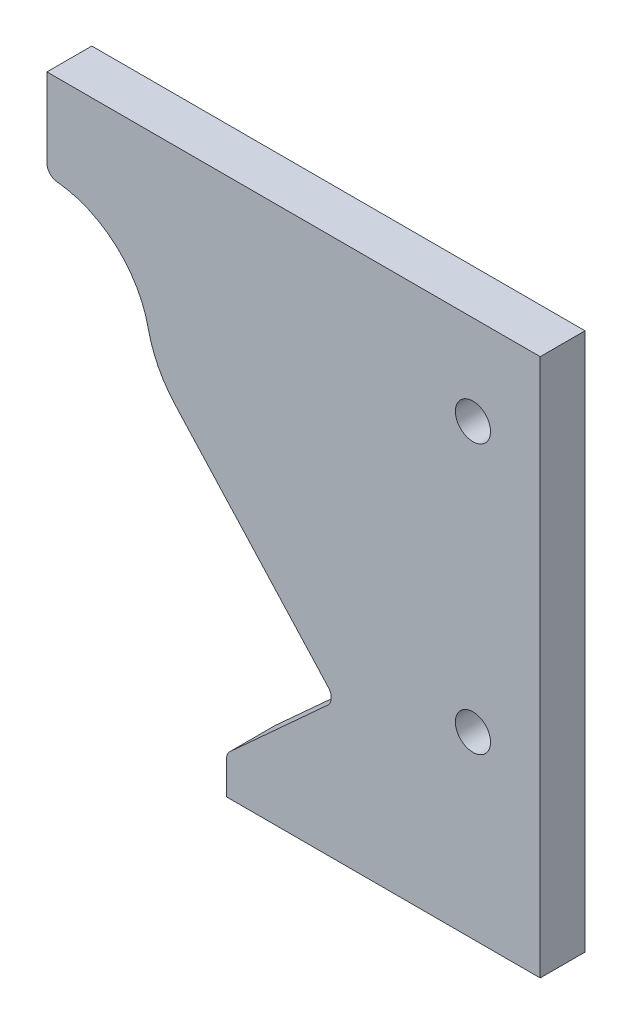
ISO-10303-21;
HEADER;
FILE_DESCRIPTION(('STEP AP214'),'2;1');
FILE_NAME('part.step','',(''),(''),'','','');
FILE_SCHEMA(('AUTOMOTIVE_DESIGN { 1 0 10303 214 1 1 1 1 }'));
ENDSEC;
DATA;
#1=APPLICATION_CONTEXT('core data for automotive mechanical design processes');
#2=APPLICATION_PROTOCOL_DEFINITION('international standard','automotive_design',2000,#1);
#3=PRODUCT_CONTEXT('',#1,'mechanical');
#4=PRODUCT('Part','Part','',(#3));
#5=PRODUCT_RELATED_PRODUCT_CATEGORY('part','',(#4));
#6=PRODUCT_DEFINITION_FORMATION('','',#4);
#7=PRODUCT_DEFINITION_CONTEXT('part definition',#1,'design');
#8=PRODUCT_DEFINITION('design','',#6,#7);
#9=PRODUCT_DEFINITION_SHAPE('','',#8);
#10=(LENGTH_UNIT() NAMED_UNIT(*) SI_UNIT(.MILLI.,.METRE.));
#11=(NAMED_UNIT(*) PLANE_ANGLE_UNIT() SI_UNIT($,.RADIAN.));
#12=(NAMED_UNIT(*) SI_UNIT($,.STERADIAN.) SOLID_ANGLE_UNIT());
#13=UNCERTAINTY_MEASURE_WITH_UNIT(LENGTH_MEASURE(1.E-05),#10,'distance_accuracy_value','');
#14=(GEOMETRIC_REPRESENTATION_CONTEXT(3) GLOBAL_UNCERTAINTY_ASSIGNED_CONTEXT((#13)) GLOBAL_UNIT_ASSIGNED_CONTEXT((#10,
#11,#12)) REPRESENTATION_CONTEXT('',''));
#15=CARTESIAN_POINT('',(0.,0.,0.));
#16=DIRECTION('',(0.,0.,1.));
#17=DIRECTION('',(1.,0.,0.));
#18=AXIS2_PLACEMENT_3D('',#15,#16,#17);
#19=CARTESIAN_POINT('',(0.,0.,3.175));
#20=DIRECTION('',(0.,0.,1.));
#21=DIRECTION('',(1.,0.,0.));
#22=AXIS2_PLACEMENT_3D('',#19,#20,#21);
#23=PLANE('',#22);
#24=CARTESIAN_POINT('',(60.325,-23.4188,3.175));
#25=DIRECTION('',(0.,0.,1.));
#26=DIRECTION('',(1.,0.,0.));
#27=AXIS2_PLACEMENT_3D('',#24,#25,#26);
#28=CIRCLE('',#27,2.4892);
#29=CARTESIAN_POINT('',(62.8142,-23.4188,3.175));
#30=VERTEX_POINT('',#29);
#31=EDGE_CURVE('E187',#30,#30,#28,.T.);
#32=ORIENTED_EDGE('',*,*,#31,.F.);
#33=EDGE_LOOP('',(#32));
#34=FACE_BOUND('',#33,.T.);
#35=DIRECTION('',(0.,-1.,0.));
#36=VECTOR('',#35,1.);
#37=CARTESIAN_POINT('',(0.,27.3812,3.175));
#38=LINE('',#37,#36);
#39=CARTESIAN_POINT('',(0.,27.3812,3.175));
#40=VERTEX_POINT('',#39);
#41=CARTESIAN_POINT('',(0.,16.1910606026906,3.175));
#42=VERTEX_POINT('',#41);
#43=EDGE_CURVE('E144',#40,#42,#38,.T.);
#44=ORIENTED_EDGE('',*,*,#43,.T.);
#45=CARTESIAN_POINT('',(1.5875,16.1910606026906,3.175));
#46=DIRECTION('',(0.,0.,1.));
#47=DIRECTION('',(1.,0.,0.));
#48=AXIS2_PLACEMENT_3D('',#45,#46,#47);
#49=CIRCLE('',#48,1.5875);
#50=CARTESIAN_POINT('',(1.43259172521468,14.6111366562922,3.175));
#51=VERTEX_POINT('',#50);
#52=EDGE_CURVE('E139',#42,#51,#49,.T.);
#53=ORIENTED_EDGE('',*,*,#52,.T.);
#54=CARTESIAN_POINT('',(0.,0.,3.175));
#55=DIRECTION('',(0.,0.,-1.));
#56=DIRECTION('',(1.,0.,0.));
#57=AXIS2_PLACEMENT_3D('',#54,#55,#56);
#58=CIRCLE('',#57,14.6812);
#59=CARTESIAN_POINT('',(14.3640874758787,3.03490105692157,3.175));
#60=VERTEX_POINT('',#59);
#61=EDGE_CURVE('E130',#51,#60,#58,.T.);
#62=ORIENTED_EDGE('',*,*,#61,.T.);
#63=CARTESIAN_POINT('',(29.8961889852617,6.31658472573749,3.175));
#64=DIRECTION('',(0.,0.,1.));
#65=DIRECTION('',(-1.,0.,0.));
#66=AXIS2_PLACEMENT_3D('',#63,#64,#65);
#67=CIRCLE('',#66,15.8749999999984);
#68=CARTESIAN_POINT('',(18.1620071037488,-4.37568353555873,3.175));
#69=VERTEX_POINT('',#68);
#70=EDGE_CURVE('E136',#60,#69,#67,.T.);
#71=ORIENTED_EDGE('',*,*,#70,.T.);
#72=DIRECTION('',(0.673528709373064,-0.73916106340246,0.));
#73=VECTOR('',#72,1.);
#74=CARTESIAN_POINT('',(40.9151539637892,-29.3460225794202,3.175));
#75=LINE('',#74,#73);
#76=CARTESIAN_POINT('',(39.8459271376594,-28.1726043912687,3.175));
#77=VERTEX_POINT('',#76);
#78=EDGE_CURVE('E161',#69,#77,#75,.T.);
#79=ORIENTED_EDGE('',*,*,#78,.T.);
#80=CARTESIAN_POINT('',(38.672508949508,-29.2418312173985,3.175));
#81=DIRECTION('',(0.,0.,1.));
#82=DIRECTION('',(1.,0.,0.));
#83=AXIS2_PLACEMENT_3D('',#80,#81,#82);
#84=CIRCLE('',#83,1.5875);
#85=CARTESIAN_POINT('',(39.7417357756377,-30.4152494055499,3.175));
#86=VERTEX_POINT('',#85);
#87=EDGE_CURVE('E11',#77,#86,#84,.F.);
#88=ORIENTED_EDGE('',*,*,#87,.T.);
#89=DIRECTION('',(-0.739161063402485,-0.673528709373036,0.));
#90=VECTOR('',#89,1.);
#91=CARTESIAN_POINT('',(25.4260338801902,-43.4598166843321,3.175));
#92=LINE('',#91,#90);
#93=CARTESIAN_POINT('',(25.9443070540605,-42.987562558428,3.175));
#94=VERTEX_POINT('',#93);
#95=EDGE_CURVE('E164',#86,#94,#92,.T.);
#96=ORIENTED_EDGE('',*,*,#95,.T.);
#97=CARTESIAN_POINT('',(27.0135338801902,-44.1609807465794,3.175));
#98=DIRECTION('',(0.,0.,1.));
#99=DIRECTION('',(1.,0.,0.));
#100=AXIS2_PLACEMENT_3D('',#97,#98,#99);
#101=CIRCLE('',#100,1.5875);
#102=CARTESIAN_POINT('',(25.4260338801902,-44.1609807465794,3.175));
#103=VERTEX_POINT('',#102);
#104=EDGE_CURVE('E57',#94,#103,#101,.T.);
#105=ORIENTED_EDGE('',*,*,#104,.T.);
#106=DIRECTION('',(0.,-1.,0.));
#107=VECTOR('',#106,1.);
#108=CARTESIAN_POINT('',(25.4260338801902,-48.8188,3.175));
#109=LINE('',#108,#107);
#110=CARTESIAN_POINT('',(25.4260338801902,-48.8188,3.175));
#111=VERTEX_POINT('',#110);
#112=EDGE_CURVE('E170',#103,#111,#109,.T.);
#113=ORIENTED_EDGE('',*,*,#112,.T.);
#114=DIRECTION('',(1.,0.,0.));
#115=VECTOR('',#114,1.);
#116=CARTESIAN_POINT('',(69.85,-48.8188,3.175));
#117=LINE('',#116,#115);
#118=CARTESIAN_POINT('',(69.85,-48.8188,3.175));
#119=VERTEX_POINT('',#118);
#120=EDGE_CURVE('E173',#111,#119,#117,.T.);
#121=ORIENTED_EDGE('',*,*,#120,.T.);
#122=DIRECTION('',(0.,1.,0.));
#123=VECTOR('',#122,1.);
#124=CARTESIAN_POINT('',(69.85,27.3812,3.175));
#125=LINE('',#124,#123);
#126=CARTESIAN_POINT('',(69.85,27.3812,3.175));
#127=VERTEX_POINT('',#126);
#128=EDGE_CURVE('E176',#119,#127,#125,.T.);
#129=ORIENTED_EDGE('',*,*,#128,.T.);
#130=DIRECTION('',(-1.,0.,0.));
#131=VECTOR('',#130,1.);
#132=CARTESIAN_POINT('',(0.,27.3812,3.175));
#133=LINE('',#132,#131);
#134=EDGE_CURVE('E179',#127,#40,#133,.T.);
#135=ORIENTED_EDGE('',*,*,#134,.T.);
#136=EDGE_LOOP('',(#44,#53,#62,#71,#79,#88,#96,#105,#113,#121,#129,#135));
#137=FACE_BOUND('',#136,.T.);
#138=CARTESIAN_POINT('',(60.325,14.6812,3.175));
#139=DIRECTION('',(0.,0.,1.));
#140=DIRECTION('',(1.,0.,0.));
#141=AXIS2_PLACEMENT_3D('',#138,#139,#140);
#142=CIRCLE('',#141,2.4892);
#143=CARTESIAN_POINT('',(62.8142,14.6812,3.175));
#144=VERTEX_POINT('',#143);
#145=EDGE_CURVE('E302',#144,#144,#142,.T.);
#146=ORIENTED_EDGE('',*,*,#145,.F.);
#147=EDGE_LOOP('',(#146));
#148=FACE_BOUND('',#147,.T.);
#149=ADVANCED_FACE('F41',(#34,#137,#148),#23,.T.);
#150=CARTESIAN_POINT('',(0.,0.,-3.175));
#151=DIRECTION('',(0.,0.,1.));
#152=DIRECTION('',(1.,0.,0.));
#153=AXIS2_PLACEMENT_3D('',#150,#151,#152);
#154=PLANE('',#153);
#155=CARTESIAN_POINT('',(0.,0.,-3.175));
#156=DIRECTION('',(0.,0.,-1.));
#157=DIRECTION('',(1.,0.,0.));
#158=AXIS2_PLACEMENT_3D('',#155,#156,#157);
#159=CIRCLE('',#158,14.6812);
#160=CARTESIAN_POINT('',(1.43259172521468,14.6111366562922,-3.175));
#161=VERTEX_POINT('',#160);
#162=CARTESIAN_POINT('',(14.3640874758787,3.03490105692157,-3.175));
#163=VERTEX_POINT('',#162);
#164=EDGE_CURVE('E150',#161,#163,#159,.T.);
#165=ORIENTED_EDGE('',*,*,#164,.F.);
#166=CARTESIAN_POINT('',(1.5875,16.1910606026906,-3.175));
#167=DIRECTION('',(0.,0.,1.));
#168=DIRECTION('',(1.,0.,0.));
#169=AXIS2_PLACEMENT_3D('',#166,#167,#168);
#170=CIRCLE('',#169,1.5875);
#171=CARTESIAN_POINT('',(0.,16.1910606026906,-3.175));
#172=VERTEX_POINT('',#171);
#173=EDGE_CURVE('E234',#161,#172,#170,.F.);
#174=ORIENTED_EDGE('',*,*,#173,.T.);
#175=DIRECTION('',(0.,-1.,0.));
#176=VECTOR('',#175,1.);
#177=CARTESIAN_POINT('',(0.,27.3812,-3.175));
#178=LINE('',#177,#176);
#179=CARTESIAN_POINT('',(0.,27.3812,-3.175));
#180=VERTEX_POINT('',#179);
#181=EDGE_CURVE('E183',#180,#172,#178,.T.);
#182=ORIENTED_EDGE('',*,*,#181,.F.);
#183=DIRECTION('',(-1.,0.,0.));
#184=VECTOR('',#183,1.);
#185=CARTESIAN_POINT('',(0.,27.3812,-3.175));
#186=LINE('',#185,#184);
#187=CARTESIAN_POINT('',(69.85,27.3812,-3.175));
#188=VERTEX_POINT('',#187);
#189=EDGE_CURVE('E209',#188,#180,#186,.T.);
#190=ORIENTED_EDGE('',*,*,#189,.F.);
#191=DIRECTION('',(0.,1.,0.));
#192=VECTOR('',#191,1.);
#193=CARTESIAN_POINT('',(69.85,27.3812,-3.175));
#194=LINE('',#193,#192);
#195=CARTESIAN_POINT('',(69.85,-48.8188,-3.175));
#196=VERTEX_POINT('',#195);
#197=EDGE_CURVE('E206',#196,#188,#194,.T.);
#198=ORIENTED_EDGE('',*,*,#197,.F.);
#199=DIRECTION('',(1.,0.,0.));
#200=VECTOR('',#199,1.);
#201=CARTESIAN_POINT('',(69.85,-48.8188,-3.175));
#202=LINE('',#201,#200);
#203=CARTESIAN_POINT('',(25.4260338801902,-48.8188,-3.175));
#204=VERTEX_POINT('',#203);
#205=EDGE_CURVE('E203',#204,#196,#202,.T.);
#206=ORIENTED_EDGE('',*,*,#205,.F.);
#207=DIRECTION('',(0.,-1.,0.));
#208=VECTOR('',#207,1.);
#209=CARTESIAN_POINT('',(25.4260338801902,-48.8188,-3.175));
#210=LINE('',#209,#208);
#211=CARTESIAN_POINT('',(25.4260338801902,-44.1609807465794,-3.175));
#212=VERTEX_POINT('',#211);
#213=EDGE_CURVE('E200',#212,#204,#210,.T.);
#214=ORIENTED_EDGE('',*,*,#213,.F.);
#215=CARTESIAN_POINT('',(27.0135338801902,-44.1609807465794,-3.175));
#216=DIRECTION('',(0.,0.,1.));
#217=DIRECTION('',(1.,0.,0.));
#218=AXIS2_PLACEMENT_3D('',#215,#216,#217);
#219=CIRCLE('',#218,1.5875);
#220=CARTESIAN_POINT('',(25.9443070540605,-42.987562558428,-3.175));
#221=VERTEX_POINT('',#220);
#222=EDGE_CURVE('E231',#212,#221,#219,.F.);
#223=ORIENTED_EDGE('',*,*,#222,.T.);
#224=DIRECTION('',(-0.739161063402485,-0.673528709373036,0.));
#225=VECTOR('',#224,1.);
#226=CARTESIAN_POINT('',(25.4260338801902,-43.4598166843321,-3.175));
#227=LINE('',#226,#225);
#228=CARTESIAN_POINT('',(39.7417357756377,-30.4152494055499,-3.175));
#229=VERTEX_POINT('',#228);
#230=EDGE_CURVE('E197',#229,#221,#227,.T.);
#231=ORIENTED_EDGE('',*,*,#230,.F.);
#232=CARTESIAN_POINT('',(38.672508949508,-29.2418312173985,-3.175));
#233=DIRECTION('',(0.,0.,1.));
#234=DIRECTION('',(1.,0.,0.));
#235=AXIS2_PLACEMENT_3D('',#232,#233,#234);
#236=CIRCLE('',#235,1.5875);
#237=CARTESIAN_POINT('',(39.8459271376594,-28.1726043912687,-3.175));
#238=VERTEX_POINT('',#237);
#239=EDGE_CURVE('E50',#229,#238,#236,.T.);
#240=ORIENTED_EDGE('',*,*,#239,.T.);
#241=DIRECTION('',(0.673528709373064,-0.73916106340246,0.));
#242=VECTOR('',#241,1.);
#243=CARTESIAN_POINT('',(40.9151539637892,-29.3460225794202,-3.175));
#244=LINE('',#243,#242);
#245=CARTESIAN_POINT('',(18.1620071037488,-4.37568353555873,-3.175));
#246=VERTEX_POINT('',#245);
#247=EDGE_CURVE('E193',#246,#238,#244,.T.);
#248=ORIENTED_EDGE('',*,*,#247,.F.);
#249=CARTESIAN_POINT('',(29.8961889852617,6.31658472573749,-3.175));
#250=DIRECTION('',(0.,0.,1.));
#251=DIRECTION('',(-1.,0.,0.));
#252=AXIS2_PLACEMENT_3D('',#249,#250,#251);
#253=CIRCLE('',#252,15.8749999999984);
#254=EDGE_CURVE('E190',#163,#246,#253,.T.);
#255=ORIENTED_EDGE('',*,*,#254,.F.);
#256=EDGE_LOOP('',(#165,#174,#182,#190,#198,#206,#214,#223,#231,#240,#248,#255));
#257=FACE_BOUND('',#256,.T.);
#258=CARTESIAN_POINT('',(60.325,-23.4188,-3.175));
#259=DIRECTION('',(0.,0.,1.));
#260=DIRECTION('',(1.,0.,0.));
#261=AXIS2_PLACEMENT_3D('',#258,#259,#260);
#262=CIRCLE('',#261,2.4892);
#263=CARTESIAN_POINT('',(62.8142,-23.4188,-3.175));
#264=VERTEX_POINT('',#263);
#265=EDGE_CURVE('E298',#264,#264,#262,.T.);
#266=ORIENTED_EDGE('',*,*,#265,.T.);
#267=EDGE_LOOP('',(#266));
#268=FACE_BOUND('',#267,.T.);
#269=CARTESIAN_POINT('',(60.325,14.6812,-3.175));
#270=DIRECTION('',(0.,0.,1.));
#271=DIRECTION('',(1.,0.,0.));
#272=AXIS2_PLACEMENT_3D('',#269,#270,#271);
#273=CIRCLE('',#272,2.4892);
#274=CARTESIAN_POINT('',(62.8142,14.6812,-3.175));
#275=VERTEX_POINT('',#274);
#276=EDGE_CURVE('E306',#275,#275,#273,.T.);
#277=ORIENTED_EDGE('',*,*,#276,.T.);
#278=EDGE_LOOP('',(#277));
#279=FACE_BOUND('',#278,.T.);
#280=ADVANCED_FACE('F260',(#257,#268,#279),#154,.F.);
#281=CARTESIAN_POINT('',(0.,27.3812,3.175));
#282=DIRECTION('',(1.,0.,0.));
#283=DIRECTION('',(0.,1.,0.));
#284=AXIS2_PLACEMENT_3D('',#281,#282,#283);
#285=PLANE('',#284);
#286=ORIENTED_EDGE('',*,*,#181,.T.);
#287=DIRECTION('',(0.,0.,-1.));
#288=VECTOR('',#287,1.);
#289=CARTESIAN_POINT('',(0.,16.1910606026906,3.175));
#290=LINE('',#289,#288);
#291=EDGE_CURVE('E237',#172,#42,#290,.F.);
#292=ORIENTED_EDGE('',*,*,#291,.T.);
#293=ORIENTED_EDGE('',*,*,#43,.F.);
#294=DIRECTION('',(0.,0.,-1.));
#295=VECTOR('',#294,1.);
#296=CARTESIAN_POINT('',(0.,27.3812,3.175));
#297=LINE('',#296,#295);
#298=EDGE_CURVE('E182',#40,#180,#297,.T.);
#299=ORIENTED_EDGE('',*,*,#298,.T.);
#300=EDGE_LOOP('',(#286,#292,#293,#299));
#301=FACE_BOUND('',#300,.T.);
#302=ADVANCED_FACE('F294',(#301),#285,.F.);
#303=CARTESIAN_POINT('',(0.,0.,3.175));
#304=DIRECTION('',(0.,0.,-1.));
#305=DIRECTION('',(-1.,0.,0.));
#306=AXIS2_PLACEMENT_3D('',#303,#304,#305);
#307=CYLINDRICAL_SURFACE('',#306,14.6812);
#308=ORIENTED_EDGE('',*,*,#61,.F.);
#309=DIRECTION('',(0.,0.,-1.));
#310=VECTOR('',#309,1.);
#311=CARTESIAN_POINT('',(1.43259172521468,14.6111366562922,3.175));
#312=LINE('',#311,#310);
#313=EDGE_CURVE('E154',#51,#161,#312,.T.);
#314=ORIENTED_EDGE('',*,*,#313,.T.);
#315=ORIENTED_EDGE('',*,*,#164,.T.);
#316=DIRECTION('',(0.,0.,-1.));
#317=VECTOR('',#316,1.);
#318=CARTESIAN_POINT('',(14.3640874758787,3.03490105692157,3.175));
#319=LINE('',#318,#317);
#320=EDGE_CURVE('E147',#60,#163,#319,.T.);
#321=ORIENTED_EDGE('',*,*,#320,.F.);
#322=EDGE_LOOP('',(#308,#314,#315,#321));
#323=FACE_BOUND('',#322,.T.);
#324=ADVANCED_FACE('F148',(#323),#307,.F.);
#325=CARTESIAN_POINT('',(29.8961889852617,6.31658472573749,3.175));
#326=DIRECTION('',(0.,0.,-1.));
#327=DIRECTION('',(-1.,0.,0.));
#328=AXIS2_PLACEMENT_3D('',#325,#326,#327);
#329=CYLINDRICAL_SURFACE('',#328,15.8749999999984);
#330=ORIENTED_EDGE('',*,*,#254,.T.);
#331=DIRECTION('',(0.,0.,-1.));
#332=VECTOR('',#331,1.);
#333=CARTESIAN_POINT('',(18.1620071037488,-4.37568353555873,3.175));
#334=LINE('',#333,#332);
#335=EDGE_CURVE('E155',#69,#246,#334,.T.);
#336=ORIENTED_EDGE('',*,*,#335,.F.);
#337=ORIENTED_EDGE('',*,*,#70,.F.);
#338=ORIENTED_EDGE('',*,*,#320,.T.);
#339=EDGE_LOOP('',(#330,#336,#337,#338));
#340=FACE_BOUND('',#339,.T.);
#341=ADVANCED_FACE('F157',(#340),#329,.T.);
#342=CARTESIAN_POINT('',(40.9151539637892,-29.3460225794202,3.175));
#343=DIRECTION('',(0.73916106340246,0.673528709373064,0.));
#344=DIRECTION('',(-0.673528709373064,0.73916106340246,0.));
#345=AXIS2_PLACEMENT_3D('',#342,#343,#344);
#346=PLANE('',#345);
#347=ORIENTED_EDGE('',*,*,#247,.T.);
#348=DIRECTION('',(0.,0.,-1.));
#349=VECTOR('',#348,1.);
#350=CARTESIAN_POINT('',(39.8459271376594,-28.1726043912687,3.175));
#351=LINE('',#350,#349);
#352=EDGE_CURVE('E250',#238,#77,#351,.F.);
#353=ORIENTED_EDGE('',*,*,#352,.T.);
#354=ORIENTED_EDGE('',*,*,#78,.F.);
#355=ORIENTED_EDGE('',*,*,#335,.T.);
#356=EDGE_LOOP('',(#347,#353,#354,#355));
#357=FACE_BOUND('',#356,.T.);
#358=ADVANCED_FACE('F266',(#357),#346,.F.);
#359=CARTESIAN_POINT('',(25.4260338801902,-43.4598166843321,3.175));
#360=DIRECTION('',(0.673528709373036,-0.739161063402485,0.));
#361=DIRECTION('',(0.739161063402485,0.673528709373036,0.));
#362=AXIS2_PLACEMENT_3D('',#359,#360,#361);
#363=PLANE('',#362);
#364=ORIENTED_EDGE('',*,*,#95,.F.);
#365=DIRECTION('',(0.,0.,-1.));
#366=VECTOR('',#365,1.);
#367=CARTESIAN_POINT('',(39.7417357756377,-30.4152494055499,-3.175));
#368=LINE('',#367,#366);
#369=EDGE_CURVE('E246',#86,#229,#368,.T.);
#370=ORIENTED_EDGE('',*,*,#369,.T.);
#371=ORIENTED_EDGE('',*,*,#230,.T.);
#372=DIRECTION('',(0.,0.,-1.));
#373=VECTOR('',#372,1.);
#374=CARTESIAN_POINT('',(25.9443070540605,-42.987562558428,3.175));
#375=LINE('',#374,#373);
#376=EDGE_CURVE('E65',#221,#94,#375,.F.);
#377=ORIENTED_EDGE('',*,*,#376,.T.);
#378=EDGE_LOOP('',(#364,#370,#371,#377));
#379=FACE_BOUND('',#378,.T.);
#380=ADVANCED_FACE('F269',(#379),#363,.F.);
#381=CARTESIAN_POINT('',(25.4260338801902,-48.8188,3.175));
#382=DIRECTION('',(1.,0.,0.));
#383=DIRECTION('',(0.,0.,-1.));
#384=AXIS2_PLACEMENT_3D('',#381,#382,#383);
#385=PLANE('',#384);
#386=ORIENTED_EDGE('',*,*,#112,.F.);
#387=DIRECTION('',(0.,0.,-1.));
#388=VECTOR('',#387,1.);
#389=CARTESIAN_POINT('',(25.4260338801902,-44.1609807465794,3.175));
#390=LINE('',#389,#388);
#391=EDGE_CURVE('E253',#103,#212,#390,.T.);
#392=ORIENTED_EDGE('',*,*,#391,.T.);
#393=ORIENTED_EDGE('',*,*,#213,.T.);
#394=DIRECTION('',(0.,0.,-1.));
#395=VECTOR('',#394,1.);
#396=CARTESIAN_POINT('',(25.4260338801902,-48.8188,3.175));
#397=LINE('',#396,#395);
#398=EDGE_CURVE('E223',#111,#204,#397,.T.);
#399=ORIENTED_EDGE('',*,*,#398,.F.);
#400=EDGE_LOOP('',(#386,#392,#393,#399));
#401=FACE_BOUND('',#400,.T.);
#402=ADVANCED_FACE('F274',(#401),#385,.F.);
#403=CARTESIAN_POINT('',(69.85,-48.8188,3.175));
#404=DIRECTION('',(0.,1.,0.));
#405=DIRECTION('',(0.,0.,1.));
#406=AXIS2_PLACEMENT_3D('',#403,#404,#405);
#407=PLANE('',#406);
#408=ORIENTED_EDGE('',*,*,#205,.T.);
#409=DIRECTION('',(0.,0.,-1.));
#410=VECTOR('',#409,1.);
#411=CARTESIAN_POINT('',(69.85,-48.8188,3.175));
#412=LINE('',#411,#410);
#413=EDGE_CURVE('E219',#119,#196,#412,.T.);
#414=ORIENTED_EDGE('',*,*,#413,.F.);
#415=ORIENTED_EDGE('',*,*,#120,.F.);
#416=ORIENTED_EDGE('',*,*,#398,.T.);
#417=EDGE_LOOP('',(#408,#414,#415,#416));
#418=FACE_BOUND('',#417,.T.);
#419=ADVANCED_FACE('F281',(#418),#407,.F.);
#420=CARTESIAN_POINT('',(69.85,27.3812,3.175));
#421=DIRECTION('',(-1.,0.,0.));
#422=DIRECTION('',(0.,-1.,0.));
#423=AXIS2_PLACEMENT_3D('',#420,#421,#422);
#424=PLANE('',#423);
#425=ORIENTED_EDGE('',*,*,#197,.T.);
#426=DIRECTION('',(0.,0.,-1.));
#427=VECTOR('',#426,1.);
#428=CARTESIAN_POINT('',(69.85,27.3812,3.175));
#429=LINE('',#428,#427);
#430=EDGE_CURVE('E215',#127,#188,#429,.T.);
#431=ORIENTED_EDGE('',*,*,#430,.F.);
#432=ORIENTED_EDGE('',*,*,#128,.F.);
#433=ORIENTED_EDGE('',*,*,#413,.T.);
#434=EDGE_LOOP('',(#425,#431,#432,#433));
#435=FACE_BOUND('',#434,.T.);
#436=ADVANCED_FACE('F285',(#435),#424,.F.);
#437=CARTESIAN_POINT('',(0.,27.3812,3.175));
#438=DIRECTION('',(0.,-1.,0.));
#439=DIRECTION('',(0.,0.,-1.));
#440=AXIS2_PLACEMENT_3D('',#437,#438,#439);
#441=PLANE('',#440);
#442=ORIENTED_EDGE('',*,*,#189,.T.);
#443=ORIENTED_EDGE('',*,*,#298,.F.);
#444=ORIENTED_EDGE('',*,*,#134,.F.);
#445=ORIENTED_EDGE('',*,*,#430,.T.);
#446=EDGE_LOOP('',(#442,#443,#444,#445));
#447=FACE_BOUND('',#446,.T.);
#448=ADVANCED_FACE('F291',(#447),#441,.F.);
#449=CARTESIAN_POINT('',(60.325,-23.4188,3.175));
#450=DIRECTION('',(0.,0.,-1.));
#451=DIRECTION('',(-1.,0.,0.));
#452=AXIS2_PLACEMENT_3D('',#449,#450,#451);
#453=CYLINDRICAL_SURFACE('',#452,2.4892);
#454=ORIENTED_EDGE('',*,*,#31,.T.);
#455=EDGE_LOOP('',(#454));
#456=FACE_BOUND('',#455,.T.);
#457=ORIENTED_EDGE('',*,*,#265,.F.);
#458=EDGE_LOOP('',(#457));
#459=FACE_BOUND('',#458,.T.);
#460=ADVANCED_FACE('F325',(#456,#459),#453,.F.);
#461=CARTESIAN_POINT('',(60.325,14.6812,3.175));
#462=DIRECTION('',(0.,0.,-1.));
#463=DIRECTION('',(-1.,0.,0.));
#464=AXIS2_PLACEMENT_3D('',#461,#462,#463);
#465=CYLINDRICAL_SURFACE('',#464,2.4892);
#466=ORIENTED_EDGE('',*,*,#145,.T.);
#467=EDGE_LOOP('',(#466));
#468=FACE_BOUND('',#467,.T.);
#469=ORIENTED_EDGE('',*,*,#276,.F.);
#470=EDGE_LOOP('',(#469));
#471=FACE_BOUND('',#470,.T.);
#472=ADVANCED_FACE('F314',(#468,#471),#465,.F.);
#473=CARTESIAN_POINT('',(1.5875,16.1910606026906,3.175));
#474=DIRECTION('',(0.,0.,-1.));
#475=DIRECTION('',(-1.,0.,0.));
#476=AXIS2_PLACEMENT_3D('',#473,#474,#475);
#477=CYLINDRICAL_SURFACE('',#476,1.5875);
#478=ORIENTED_EDGE('',*,*,#52,.F.);
#479=ORIENTED_EDGE('',*,*,#291,.F.);
#480=ORIENTED_EDGE('',*,*,#173,.F.);
#481=ORIENTED_EDGE('',*,*,#313,.F.);
#482=EDGE_LOOP('',(#478,#479,#480,#481));
#483=FACE_BOUND('',#482,.T.);
#484=ADVANCED_FACE('F346',(#483),#477,.T.);
#485=CARTESIAN_POINT('',(38.672508949508,-29.2418312173985,3.175));
#486=DIRECTION('',(0.,0.,1.));
#487=DIRECTION('',(1.,0.,0.));
#488=AXIS2_PLACEMENT_3D('',#485,#486,#487);
#489=CYLINDRICAL_SURFACE('',#488,1.5875);
#490=ORIENTED_EDGE('',*,*,#87,.F.);
#491=ORIENTED_EDGE('',*,*,#352,.F.);
#492=ORIENTED_EDGE('',*,*,#239,.F.);
#493=ORIENTED_EDGE('',*,*,#369,.F.);
#494=EDGE_LOOP('',(#490,#491,#492,#493));
#495=FACE_BOUND('',#494,.T.);
#496=ADVANCED_FACE('F268',(#495),#489,.F.);
#497=CARTESIAN_POINT('',(27.0135338801902,-44.1609807465794,3.175));
#498=DIRECTION('',(0.,0.,-1.));
#499=DIRECTION('',(-1.,0.,0.));
#500=AXIS2_PLACEMENT_3D('',#497,#498,#499);
#501=CYLINDRICAL_SURFACE('',#500,1.5875);
#502=ORIENTED_EDGE('',*,*,#104,.F.);
#503=ORIENTED_EDGE('',*,*,#376,.F.);
#504=ORIENTED_EDGE('',*,*,#222,.F.);
#505=ORIENTED_EDGE('',*,*,#391,.F.);
#506=EDGE_LOOP('',(#502,#503,#504,#505));
#507=FACE_BOUND('',#506,.T.);
#508=ADVANCED_FACE('F43',(#507),#501,.T.);
#509=CLOSED_SHELL('',(#149,#280,#302,#324,#341,#358,#380,#402,#419,#436,#448,#460,#472,#484,
#496,#508));
#510=MANIFOLD_SOLID_BREP('B2',#509);
#511=ADVANCED_BREP_SHAPE_REPRESENTATION('',(#18,#510),#14);
#512=SHAPE_DEFINITION_REPRESENTATION(#9,#511);
ENDSEC;
END-ISO-10303-21;
